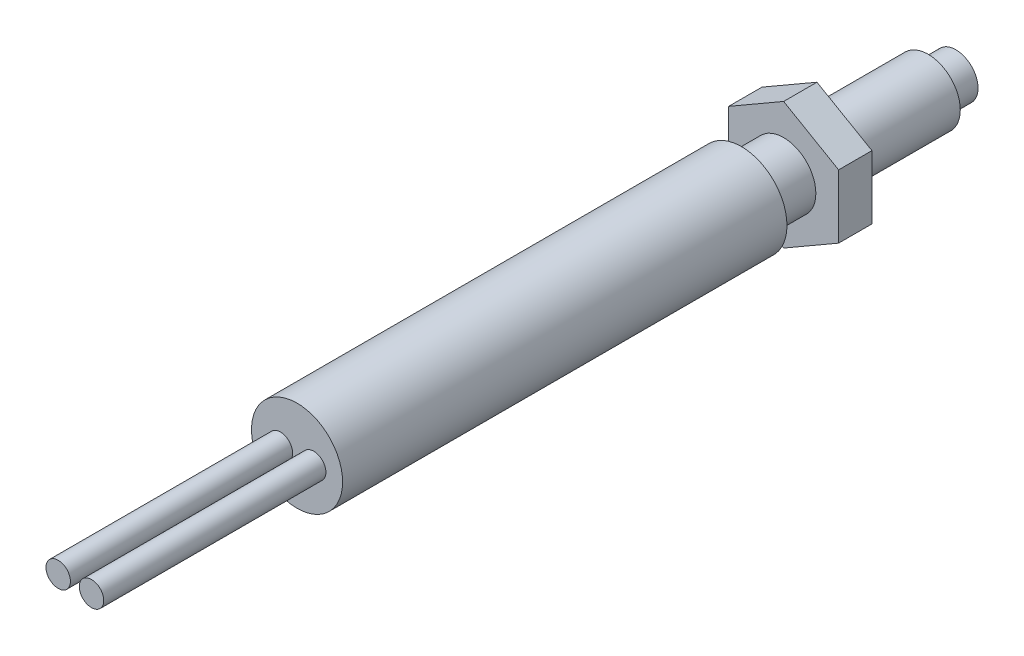
ISO-10303-21;
HEADER;
FILE_DESCRIPTION(('STEP AP214'),'2;1');
FILE_NAME('part.step','',(''),(''),'','','');
FILE_SCHEMA(('AUTOMOTIVE_DESIGN { 1 0 10303 214 1 1 1 1 }'));
ENDSEC;
DATA;
#1=APPLICATION_CONTEXT('core data for automotive mechanical design processes');
#2=APPLICATION_PROTOCOL_DEFINITION('international standard','automotive_design',2000,#1);
#3=PRODUCT_CONTEXT('',#1,'mechanical');
#4=PRODUCT('Part','Part','',(#3));
#5=PRODUCT_RELATED_PRODUCT_CATEGORY('part','',(#4));
#6=PRODUCT_DEFINITION_FORMATION('','',#4);
#7=PRODUCT_DEFINITION_CONTEXT('part definition',#1,'design');
#8=PRODUCT_DEFINITION('design','',#6,#7);
#9=PRODUCT_DEFINITION_SHAPE('','',#8);
#10=(LENGTH_UNIT() NAMED_UNIT(*) SI_UNIT(.MILLI.,.METRE.));
#11=(NAMED_UNIT(*) PLANE_ANGLE_UNIT() SI_UNIT($,.RADIAN.));
#12=(NAMED_UNIT(*) SI_UNIT($,.STERADIAN.) SOLID_ANGLE_UNIT());
#13=UNCERTAINTY_MEASURE_WITH_UNIT(LENGTH_MEASURE(1.E-05),#10,'distance_accuracy_value','');
#14=(GEOMETRIC_REPRESENTATION_CONTEXT(3) GLOBAL_UNCERTAINTY_ASSIGNED_CONTEXT((#13)) GLOBAL_UNIT_ASSIGNED_CONTEXT((#10,
#11,#12)) REPRESENTATION_CONTEXT('',''));
#15=CARTESIAN_POINT('',(0.,0.,0.));
#16=DIRECTION('',(0.,0.,1.));
#17=DIRECTION('',(1.,0.,0.));
#18=AXIS2_PLACEMENT_3D('',#15,#16,#17);
#19=CARTESIAN_POINT('',(0.,0.,16.8));
#20=DIRECTION('',(0.,0.,-1.));
#21=DIRECTION('',(-1.,0.,0.));
#22=AXIS2_PLACEMENT_3D('',#19,#20,#21);
#23=CYLINDRICAL_SURFACE('',#22,2.9);
#24=CARTESIAN_POINT('',(0.,0.,13.));
#25=DIRECTION('',(0.,0.,1.));
#26=DIRECTION('',(1.,0.,0.));
#27=AXIS2_PLACEMENT_3D('',#24,#25,#26);
#28=CIRCLE('',#27,2.9);
#29=CARTESIAN_POINT('',(2.9,0.,13.));
#30=VERTEX_POINT('',#29);
#31=EDGE_CURVE('E36',#30,#30,#28,.T.);
#32=ORIENTED_EDGE('',*,*,#31,.T.);
#33=EDGE_LOOP('',(#32));
#34=FACE_BOUND('',#33,.T.);
#35=CARTESIAN_POINT('',(0.,0.,16.8));
#36=DIRECTION('',(0.,0.,1.));
#37=DIRECTION('',(1.,0.,0.));
#38=AXIS2_PLACEMENT_3D('',#35,#36,#37);
#39=CIRCLE('',#38,2.9);
#40=CARTESIAN_POINT('',(2.9,0.,16.8));
#41=VERTEX_POINT('',#40);
#42=EDGE_CURVE('E162',#41,#41,#39,.T.);
#43=ORIENTED_EDGE('',*,*,#42,.F.);
#44=EDGE_LOOP('',(#43));
#45=FACE_BOUND('',#44,.T.);
#46=ADVANCED_FACE('F33',(#34,#45),#23,.T.);
#47=CARTESIAN_POINT('',(0.,0.,56.8));
#48=DIRECTION('',(0.,0.,-1.));
#49=DIRECTION('',(-1.,0.,0.));
#50=AXIS2_PLACEMENT_3D('',#47,#48,#49);
#51=CYLINDRICAL_SURFACE('',#50,4.1);
#52=CARTESIAN_POINT('',(0.,0.,56.8));
#53=DIRECTION('',(0.,0.,1.));
#54=DIRECTION('',(1.,0.,0.));
#55=AXIS2_PLACEMENT_3D('',#52,#53,#54);
#56=CIRCLE('',#55,4.1);
#57=CARTESIAN_POINT('',(4.1,0.,56.8));
#58=VERTEX_POINT('',#57);
#59=EDGE_CURVE('E151',#58,#58,#56,.T.);
#60=ORIENTED_EDGE('',*,*,#59,.F.);
#61=EDGE_LOOP('',(#60));
#62=FACE_BOUND('',#61,.T.);
#63=CARTESIAN_POINT('',(0.,0.,16.8));
#64=DIRECTION('',(0.,0.,1.));
#65=DIRECTION('',(1.,0.,0.));
#66=AXIS2_PLACEMENT_3D('',#63,#64,#65);
#67=CIRCLE('',#66,4.1);
#68=CARTESIAN_POINT('',(4.1,0.,16.8));
#69=VERTEX_POINT('',#68);
#70=EDGE_CURVE('E147',#69,#69,#67,.T.);
#71=ORIENTED_EDGE('',*,*,#70,.T.);
#72=EDGE_LOOP('',(#71));
#73=FACE_BOUND('',#72,.T.);
#74=ADVANCED_FACE('F185',(#62,#73),#51,.T.);
#75=CARTESIAN_POINT('',(0.,0.,56.8));
#76=DIRECTION('',(0.,0.,1.));
#77=DIRECTION('',(1.,0.,0.));
#78=AXIS2_PLACEMENT_3D('',#75,#76,#77);
#79=PLANE('',#78);
#80=CARTESIAN_POINT('',(1.5,0.,56.8));
#81=DIRECTION('',(0.,0.,1.));
#82=DIRECTION('',(-1.,0.,0.));
#83=AXIS2_PLACEMENT_3D('',#80,#81,#82);
#84=CIRCLE('',#83,1.1);
#85=CARTESIAN_POINT('',(0.4,0.,56.8));
#86=VERTEX_POINT('',#85);
#87=EDGE_CURVE('E142',#86,#86,#84,.T.);
#88=ORIENTED_EDGE('',*,*,#87,.F.);
#89=EDGE_LOOP('',(#88));
#90=FACE_BOUND('',#89,.T.);
#91=CARTESIAN_POINT('',(-1.5,0.,56.8));
#92=DIRECTION('',(0.,0.,1.));
#93=DIRECTION('',(1.,0.,0.));
#94=AXIS2_PLACEMENT_3D('',#91,#92,#93);
#95=CIRCLE('',#94,1.1);
#96=CARTESIAN_POINT('',(-0.4,0.,56.8));
#97=VERTEX_POINT('',#96);
#98=EDGE_CURVE('E42',#97,#97,#95,.T.);
#99=ORIENTED_EDGE('',*,*,#98,.F.);
#100=EDGE_LOOP('',(#99));
#101=FACE_BOUND('',#100,.T.);
#102=ORIENTED_EDGE('',*,*,#59,.T.);
#103=EDGE_LOOP('',(#102));
#104=FACE_BOUND('',#103,.T.);
#105=ADVANCED_FACE('F191',(#90,#101,#104),#79,.T.);
#106=CARTESIAN_POINT('',(0.,0.,16.8));
#107=DIRECTION('',(0.,0.,1.));
#108=DIRECTION('',(1.,0.,0.));
#109=AXIS2_PLACEMENT_3D('',#106,#107,#108);
#110=PLANE('',#109);
#111=ORIENTED_EDGE('',*,*,#42,.T.);
#112=EDGE_LOOP('',(#111));
#113=FACE_BOUND('',#112,.T.);
#114=ORIENTED_EDGE('',*,*,#70,.F.);
#115=EDGE_LOOP('',(#114));
#116=FACE_BOUND('',#115,.T.);
#117=ADVANCED_FACE('F199',(#113,#116),#110,.F.);
#118=CARTESIAN_POINT('',(-1.5,0.,76.8));
#119=DIRECTION('',(0.,0.,-1.));
#120=DIRECTION('',(-1.,0.,0.));
#121=AXIS2_PLACEMENT_3D('',#118,#119,#120);
#122=CYLINDRICAL_SURFACE('',#121,1.1);
#123=CARTESIAN_POINT('',(-1.5,0.,76.8));
#124=DIRECTION('',(0.,0.,1.));
#125=DIRECTION('',(1.,0.,0.));
#126=AXIS2_PLACEMENT_3D('',#123,#124,#125);
#127=CIRCLE('',#126,1.1);
#128=CARTESIAN_POINT('',(-0.4,0.,76.8));
#129=VERTEX_POINT('',#128);
#130=EDGE_CURVE('E141',#129,#129,#127,.T.);
#131=ORIENTED_EDGE('',*,*,#130,.F.);
#132=EDGE_LOOP('',(#131));
#133=FACE_BOUND('',#132,.T.);
#134=ORIENTED_EDGE('',*,*,#98,.T.);
#135=EDGE_LOOP('',(#134));
#136=FACE_BOUND('',#135,.T.);
#137=ADVANCED_FACE('F202',(#133,#136),#122,.T.);
#138=CARTESIAN_POINT('',(-1.5,0.,76.8));
#139=DIRECTION('',(0.,0.,1.));
#140=DIRECTION('',(1.,0.,0.));
#141=AXIS2_PLACEMENT_3D('',#138,#139,#140);
#142=PLANE('',#141);
#143=ORIENTED_EDGE('',*,*,#130,.T.);
#144=EDGE_LOOP('',(#143));
#145=FACE_BOUND('',#144,.T.);
#146=ADVANCED_FACE('F210',(#145),#142,.T.);
#147=CARTESIAN_POINT('',(1.5,0.,76.8));
#148=DIRECTION('',(0.,0.,-1.));
#149=DIRECTION('',(-1.,0.,0.));
#150=AXIS2_PLACEMENT_3D('',#147,#148,#149);
#151=CYLINDRICAL_SURFACE('',#150,1.1);
#152=CARTESIAN_POINT('',(1.5,0.,76.8));
#153=DIRECTION('',(0.,0.,1.));
#154=DIRECTION('',(-1.,0.,0.));
#155=AXIS2_PLACEMENT_3D('',#152,#153,#154);
#156=CIRCLE('',#155,1.1);
#157=CARTESIAN_POINT('',(0.4,0.,76.8));
#158=VERTEX_POINT('',#157);
#159=EDGE_CURVE('E138',#158,#158,#156,.T.);
#160=ORIENTED_EDGE('',*,*,#159,.F.);
#161=EDGE_LOOP('',(#160));
#162=FACE_BOUND('',#161,.T.);
#163=ORIENTED_EDGE('',*,*,#87,.T.);
#164=EDGE_LOOP('',(#163));
#165=FACE_BOUND('',#164,.T.);
#166=ADVANCED_FACE('F254',(#162,#165),#151,.T.);
#167=CARTESIAN_POINT('',(1.5,0.,76.8));
#168=DIRECTION('',(0.,0.,-1.));
#169=DIRECTION('',(-1.,0.,0.));
#170=AXIS2_PLACEMENT_3D('',#167,#168,#169);
#171=PLANE('',#170);
#172=ORIENTED_EDGE('',*,*,#159,.T.);
#173=EDGE_LOOP('',(#172));
#174=FACE_BOUND('',#173,.T.);
#175=ADVANCED_FACE('F250',(#174),#171,.F.);
#176=CARTESIAN_POINT('',(-4.95,-2.85788383248865,13.));
#177=DIRECTION('',(0.5,0.866025403784439,0.));
#178=DIRECTION('',(-0.866025403784439,0.5,0.));
#179=AXIS2_PLACEMENT_3D('',#176,#177,#178);
#180=PLANE('',#179);
#181=DIRECTION('',(0.866025403784439,-0.5,0.));
#182=VECTOR('',#181,1.);
#183=CARTESIAN_POINT('',(-4.95,-2.85788383248865,10.));
#184=LINE('',#183,#182);
#185=CARTESIAN_POINT('',(-4.95,-2.85788383248865,10.));
#186=VERTEX_POINT('',#185);
#187=CARTESIAN_POINT('',(0.,-5.7157676649773,10.));
#188=VERTEX_POINT('',#187);
#189=EDGE_CURVE('E119',#186,#188,#184,.T.);
#190=ORIENTED_EDGE('',*,*,#189,.T.);
#191=DIRECTION('',(0.,0.,-1.));
#192=VECTOR('',#191,1.);
#193=CARTESIAN_POINT('',(0.,-5.7157676649773,13.));
#194=LINE('',#193,#192);
#195=CARTESIAN_POINT('',(0.,-5.7157676649773,13.));
#196=VERTEX_POINT('',#195);
#197=EDGE_CURVE('E136',#196,#188,#194,.T.);
#198=ORIENTED_EDGE('',*,*,#197,.F.);
#199=DIRECTION('',(0.866025403784439,-0.5,0.));
#200=VECTOR('',#199,1.);
#201=CARTESIAN_POINT('',(-4.95,-2.85788383248865,13.));
#202=LINE('',#201,#200);
#203=CARTESIAN_POINT('',(-4.95,-2.85788383248865,13.));
#204=VERTEX_POINT('',#203);
#205=EDGE_CURVE('E129',#204,#196,#202,.T.);
#206=ORIENTED_EDGE('',*,*,#205,.F.);
#207=DIRECTION('',(0.,0.,-1.));
#208=VECTOR('',#207,1.);
#209=CARTESIAN_POINT('',(-4.95,-2.85788383248865,13.));
#210=LINE('',#209,#208);
#211=EDGE_CURVE('E115',#204,#186,#210,.T.);
#212=ORIENTED_EDGE('',*,*,#211,.T.);
#213=EDGE_LOOP('',(#190,#198,#206,#212));
#214=FACE_BOUND('',#213,.T.);
#215=ADVANCED_FACE('F247',(#214),#180,.F.);
#216=CARTESIAN_POINT('',(0.,-5.7157676649773,13.));
#217=DIRECTION('',(-0.5,0.866025403784439,0.));
#218=DIRECTION('',(-0.866025403784439,-0.5,0.));
#219=AXIS2_PLACEMENT_3D('',#216,#217,#218);
#220=PLANE('',#219);
#221=DIRECTION('',(0.866025403784439,0.5,0.));
#222=VECTOR('',#221,1.);
#223=CARTESIAN_POINT('',(0.,-5.7157676649773,10.));
#224=LINE('',#223,#222);
#225=CARTESIAN_POINT('',(4.95,-2.85788383248865,10.));
#226=VERTEX_POINT('',#225);
#227=EDGE_CURVE('E122',#188,#226,#224,.T.);
#228=ORIENTED_EDGE('',*,*,#227,.T.);
#229=DIRECTION('',(0.,0.,-1.));
#230=VECTOR('',#229,1.);
#231=CARTESIAN_POINT('',(4.95,-2.85788383248865,13.));
#232=LINE('',#231,#230);
#233=CARTESIAN_POINT('',(4.95,-2.85788383248865,13.));
#234=VERTEX_POINT('',#233);
#235=EDGE_CURVE('E133',#234,#226,#232,.T.);
#236=ORIENTED_EDGE('',*,*,#235,.F.);
#237=DIRECTION('',(0.866025403784439,0.5,0.));
#238=VECTOR('',#237,1.);
#239=CARTESIAN_POINT('',(0.,-5.7157676649773,13.));
#240=LINE('',#239,#238);
#241=EDGE_CURVE('E88',#196,#234,#240,.T.);
#242=ORIENTED_EDGE('',*,*,#241,.F.);
#243=ORIENTED_EDGE('',*,*,#197,.T.);
#244=EDGE_LOOP('',(#228,#236,#242,#243));
#245=FACE_BOUND('',#244,.T.);
#246=ADVANCED_FACE('F243',(#245),#220,.F.);
#247=CARTESIAN_POINT('',(4.95,-2.85788383248865,13.));
#248=DIRECTION('',(-1.,0.,0.));
#249=DIRECTION('',(0.,0.,1.));
#250=AXIS2_PLACEMENT_3D('',#247,#248,#249);
#251=PLANE('',#250);
#252=DIRECTION('',(0.,1.,0.));
#253=VECTOR('',#252,1.);
#254=CARTESIAN_POINT('',(4.95,-2.85788383248865,10.));
#255=LINE('',#254,#253);
#256=CARTESIAN_POINT('',(4.95,2.85788383248865,10.));
#257=VERTEX_POINT('',#256);
#258=EDGE_CURVE('E124',#226,#257,#255,.T.);
#259=ORIENTED_EDGE('',*,*,#258,.T.);
#260=DIRECTION('',(0.,0.,-1.));
#261=VECTOR('',#260,1.);
#262=CARTESIAN_POINT('',(4.95,2.85788383248865,13.));
#263=LINE('',#262,#261);
#264=CARTESIAN_POINT('',(4.95,2.85788383248865,13.));
#265=VERTEX_POINT('',#264);
#266=EDGE_CURVE('E110',#265,#257,#263,.T.);
#267=ORIENTED_EDGE('',*,*,#266,.F.);
#268=DIRECTION('',(0.,1.,0.));
#269=VECTOR('',#268,1.);
#270=CARTESIAN_POINT('',(4.95,-2.85788383248865,13.));
#271=LINE('',#270,#269);
#272=EDGE_CURVE('E101',#234,#265,#271,.T.);
#273=ORIENTED_EDGE('',*,*,#272,.F.);
#274=ORIENTED_EDGE('',*,*,#235,.T.);
#275=EDGE_LOOP('',(#259,#267,#273,#274));
#276=FACE_BOUND('',#275,.T.);
#277=ADVANCED_FACE('F240',(#276),#251,.F.);
#278=CARTESIAN_POINT('',(4.95,2.85788383248865,13.));
#279=DIRECTION('',(-0.5,-0.866025403784439,0.));
#280=DIRECTION('',(0.866025403784439,-0.5,0.));
#281=AXIS2_PLACEMENT_3D('',#278,#279,#280);
#282=PLANE('',#281);
#283=DIRECTION('',(-0.866025403784439,0.5,0.));
#284=VECTOR('',#283,1.);
#285=CARTESIAN_POINT('',(4.95,2.85788383248865,10.));
#286=LINE('',#285,#284);
#287=CARTESIAN_POINT('',(0.,5.7157676649773,10.));
#288=VERTEX_POINT('',#287);
#289=EDGE_CURVE('E109',#257,#288,#286,.T.);
#290=ORIENTED_EDGE('',*,*,#289,.T.);
#291=DIRECTION('',(0.,0.,-1.));
#292=VECTOR('',#291,1.);
#293=CARTESIAN_POINT('',(0.,5.7157676649773,13.));
#294=LINE('',#293,#292);
#295=CARTESIAN_POINT('',(0.,5.7157676649773,13.));
#296=VERTEX_POINT('',#295);
#297=EDGE_CURVE('E106',#296,#288,#294,.T.);
#298=ORIENTED_EDGE('',*,*,#297,.F.);
#299=DIRECTION('',(-0.866025403784439,0.5,0.));
#300=VECTOR('',#299,1.);
#301=CARTESIAN_POINT('',(4.95,2.85788383248865,13.));
#302=LINE('',#301,#300);
#303=EDGE_CURVE('E95',#265,#296,#302,.T.);
#304=ORIENTED_EDGE('',*,*,#303,.F.);
#305=ORIENTED_EDGE('',*,*,#266,.T.);
#306=EDGE_LOOP('',(#290,#298,#304,#305));
#307=FACE_BOUND('',#306,.T.);
#308=ADVANCED_FACE('F107',(#307),#282,.F.);
#309=CARTESIAN_POINT('',(0.,5.7157676649773,13.));
#310=DIRECTION('',(0.5,-0.866025403784439,0.));
#311=DIRECTION('',(0.866025403784439,0.5,0.));
#312=AXIS2_PLACEMENT_3D('',#309,#310,#311);
#313=PLANE('',#312);
#314=DIRECTION('',(-0.866025403784439,-0.5,0.));
#315=VECTOR('',#314,1.);
#316=CARTESIAN_POINT('',(0.,5.7157676649773,10.));
#317=LINE('',#316,#315);
#318=CARTESIAN_POINT('',(-4.95,2.85788383248865,10.));
#319=VERTEX_POINT('',#318);
#320=EDGE_CURVE('E73',#288,#319,#317,.T.);
#321=ORIENTED_EDGE('',*,*,#320,.T.);
#322=DIRECTION('',(0.,0.,-1.));
#323=VECTOR('',#322,1.);
#324=CARTESIAN_POINT('',(-4.95,2.85788383248865,13.));
#325=LINE('',#324,#323);
#326=CARTESIAN_POINT('',(-4.95,2.85788383248865,13.));
#327=VERTEX_POINT('',#326);
#328=EDGE_CURVE('E111',#327,#319,#325,.T.);
#329=ORIENTED_EDGE('',*,*,#328,.F.);
#330=DIRECTION('',(-0.866025403784439,-0.5,0.));
#331=VECTOR('',#330,1.);
#332=CARTESIAN_POINT('',(0.,5.7157676649773,13.));
#333=LINE('',#332,#331);
#334=EDGE_CURVE('E99',#296,#327,#333,.T.);
#335=ORIENTED_EDGE('',*,*,#334,.F.);
#336=ORIENTED_EDGE('',*,*,#297,.T.);
#337=EDGE_LOOP('',(#321,#329,#335,#336));
#338=FACE_BOUND('',#337,.T.);
#339=ADVANCED_FACE('F113',(#338),#313,.F.);
#340=CARTESIAN_POINT('',(-4.95,2.85788383248865,13.));
#341=DIRECTION('',(1.,0.,0.));
#342=DIRECTION('',(0.,1.,0.));
#343=AXIS2_PLACEMENT_3D('',#340,#341,#342);
#344=PLANE('',#343);
#345=DIRECTION('',(0.,-1.,0.));
#346=VECTOR('',#345,1.);
#347=CARTESIAN_POINT('',(-4.95,2.85788383248865,10.));
#348=LINE('',#347,#346);
#349=EDGE_CURVE('E79',#319,#186,#348,.T.);
#350=ORIENTED_EDGE('',*,*,#349,.T.);
#351=ORIENTED_EDGE('',*,*,#211,.F.);
#352=DIRECTION('',(0.,-1.,0.));
#353=VECTOR('',#352,1.);
#354=CARTESIAN_POINT('',(-4.95,2.85788383248865,13.));
#355=LINE('',#354,#353);
#356=EDGE_CURVE('E50',#327,#204,#355,.T.);
#357=ORIENTED_EDGE('',*,*,#356,.F.);
#358=ORIENTED_EDGE('',*,*,#328,.T.);
#359=EDGE_LOOP('',(#350,#351,#357,#358));
#360=FACE_BOUND('',#359,.T.);
#361=ADVANCED_FACE('F229',(#360),#344,.F.);
#362=CARTESIAN_POINT('',(0.,0.,13.));
#363=DIRECTION('',(0.,0.,1.));
#364=DIRECTION('',(1.,0.,0.));
#365=AXIS2_PLACEMENT_3D('',#362,#363,#364);
#366=PLANE('',#365);
#367=ORIENTED_EDGE('',*,*,#31,.F.);
#368=EDGE_LOOP('',(#367));
#369=FACE_BOUND('',#368,.T.);
#370=ORIENTED_EDGE('',*,*,#205,.T.);
#371=ORIENTED_EDGE('',*,*,#241,.T.);
#372=ORIENTED_EDGE('',*,*,#272,.T.);
#373=ORIENTED_EDGE('',*,*,#303,.T.);
#374=ORIENTED_EDGE('',*,*,#334,.T.);
#375=ORIENTED_EDGE('',*,*,#356,.T.);
#376=EDGE_LOOP('',(#370,#371,#372,#373,#374,#375));
#377=FACE_BOUND('',#376,.T.);
#378=ADVANCED_FACE('F97',(#369,#377),#366,.T.);
#379=CARTESIAN_POINT('',(0.,0.,10.));
#380=DIRECTION('',(0.,0.,1.));
#381=DIRECTION('',(1.,0.,0.));
#382=AXIS2_PLACEMENT_3D('',#379,#380,#381);
#383=PLANE('',#382);
#384=CARTESIAN_POINT('',(0.,0.,10.));
#385=DIRECTION('',(0.,0.,1.));
#386=DIRECTION('',(1.,0.,0.));
#387=AXIS2_PLACEMENT_3D('',#384,#385,#386);
#388=CIRCLE('',#387,2.9);
#389=CARTESIAN_POINT('',(2.9,0.,10.));
#390=VERTEX_POINT('',#389);
#391=EDGE_CURVE('E11',#390,#390,#388,.T.);
#392=ORIENTED_EDGE('',*,*,#391,.T.);
#393=EDGE_LOOP('',(#392));
#394=FACE_BOUND('',#393,.T.);
#395=ORIENTED_EDGE('',*,*,#189,.F.);
#396=ORIENTED_EDGE('',*,*,#349,.F.);
#397=ORIENTED_EDGE('',*,*,#320,.F.);
#398=ORIENTED_EDGE('',*,*,#289,.F.);
#399=ORIENTED_EDGE('',*,*,#258,.F.);
#400=ORIENTED_EDGE('',*,*,#227,.F.);
#401=EDGE_LOOP('',(#395,#396,#397,#398,#399,#400));
#402=FACE_BOUND('',#401,.T.);
#403=ADVANCED_FACE('F217',(#394,#402),#383,.F.);
#404=CARTESIAN_POINT('',(0.,0.,-2.5));
#405=DIRECTION('',(0.,0.,-1.));
#406=DIRECTION('',(-1.,0.,0.));
#407=AXIS2_PLACEMENT_3D('',#404,#405,#406);
#408=PLANE('',#407);
#409=CARTESIAN_POINT('',(0.,0.,-2.5));
#410=DIRECTION('',(0.,0.,-1.));
#411=DIRECTION('',(-1.,0.,0.));
#412=AXIS2_PLACEMENT_3D('',#409,#410,#411);
#413=CIRCLE('',#412,2.);
#414=CARTESIAN_POINT('',(-2.,0.,-2.5));
#415=VERTEX_POINT('',#414);
#416=EDGE_CURVE('E154',#415,#415,#413,.T.);
#417=ORIENTED_EDGE('',*,*,#416,.T.);
#418=EDGE_LOOP('',(#417));
#419=FACE_BOUND('',#418,.T.);
#420=ADVANCED_FACE('F180',(#419),#408,.T.);
#421=CARTESIAN_POINT('',(0.,0.,-2.5));
#422=DIRECTION('',(0.,0.,1.));
#423=DIRECTION('',(1.,0.,0.));
#424=AXIS2_PLACEMENT_3D('',#421,#422,#423);
#425=CYLINDRICAL_SURFACE('',#424,2.);
#426=ORIENTED_EDGE('',*,*,#416,.F.);
#427=EDGE_LOOP('',(#426));
#428=FACE_BOUND('',#427,.T.);
#429=CARTESIAN_POINT('',(0.,0.,0.));
#430=DIRECTION('',(0.,0.,-1.));
#431=DIRECTION('',(-1.,0.,0.));
#432=AXIS2_PLACEMENT_3D('',#429,#430,#431);
#433=CIRCLE('',#432,2.);
#434=CARTESIAN_POINT('',(-2.,0.,0.));
#435=VERTEX_POINT('',#434);
#436=EDGE_CURVE('E150',#435,#435,#433,.T.);
#437=ORIENTED_EDGE('',*,*,#436,.T.);
#438=EDGE_LOOP('',(#437));
#439=FACE_BOUND('',#438,.T.);
#440=ADVANCED_FACE('F173',(#428,#439),#425,.T.);
#441=CARTESIAN_POINT('',(0.,0.,0.));
#442=DIRECTION('',(0.,0.,1.));
#443=DIRECTION('',(1.,0.,0.));
#444=AXIS2_PLACEMENT_3D('',#441,#442,#443);
#445=PLANE('',#444);
#446=ORIENTED_EDGE('',*,*,#436,.F.);
#447=EDGE_LOOP('',(#446));
#448=FACE_BOUND('',#447,.T.);
#449=CARTESIAN_POINT('',(0.,0.,0.));
#450=DIRECTION('',(0.,0.,1.));
#451=DIRECTION('',(1.,0.,0.));
#452=AXIS2_PLACEMENT_3D('',#449,#450,#451);
#453=CIRCLE('',#452,2.9);
#454=CARTESIAN_POINT('',(2.9,0.,0.));
#455=VERTEX_POINT('',#454);
#456=EDGE_CURVE('E159',#455,#455,#453,.T.);
#457=ORIENTED_EDGE('',*,*,#456,.F.);
#458=EDGE_LOOP('',(#457));
#459=FACE_BOUND('',#458,.T.);
#460=ADVANCED_FACE('F171',(#448,#459),#445,.F.);
#461=ORIENTED_EDGE('',*,*,#456,.T.);
#462=EDGE_LOOP('',(#461));
#463=FACE_BOUND('',#462,.T.);
#464=ORIENTED_EDGE('',*,*,#391,.F.);
#465=EDGE_LOOP('',(#464));
#466=FACE_BOUND('',#465,.T.);
#467=ADVANCED_FACE('F168',(#463,#466),#23,.T.);
#468=CLOSED_SHELL('',(#46,#74,#105,#117,#137,#146,#166,#175,#215,#246,#277,#308,#339,#361,#378,
#403,#420,#440,#460,#467));
#469=MANIFOLD_SOLID_BREP('B2',#468);
#470=ADVANCED_BREP_SHAPE_REPRESENTATION('',(#18,#469),#14);
#471=SHAPE_DEFINITION_REPRESENTATION(#9,#470);
ENDSEC;
END-ISO-10303-21;
